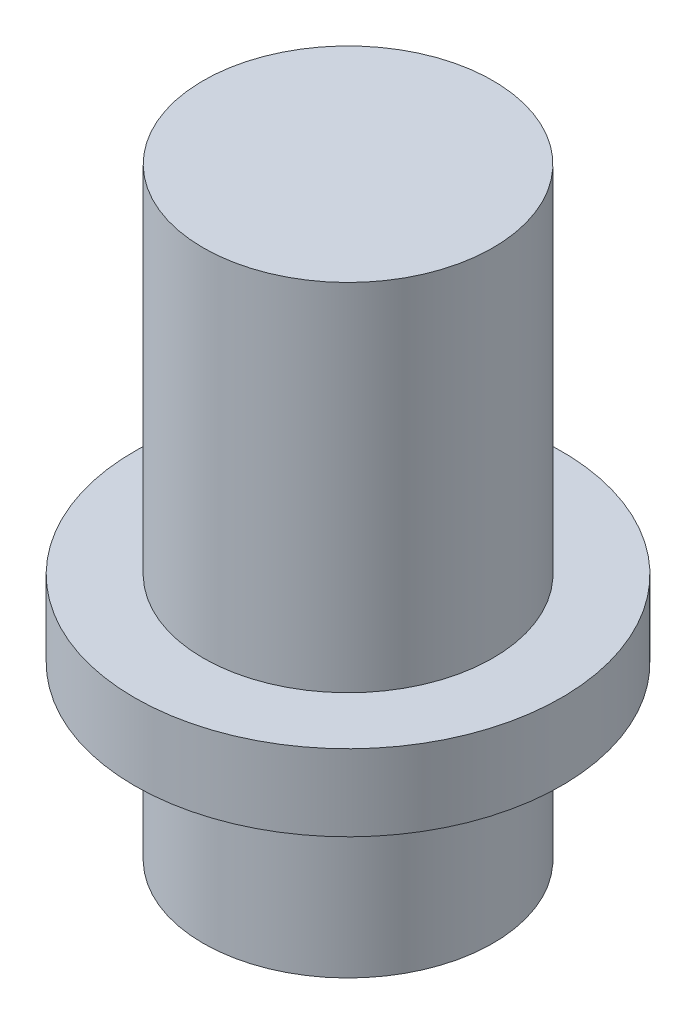
ISO-10303-21;
HEADER;
FILE_DESCRIPTION(('STEP AP214'),'2;1');
FILE_NAME('part.step','',(''),(''),'','','');
FILE_SCHEMA(('AUTOMOTIVE_DESIGN { 1 0 10303 214 1 1 1 1 }'));
ENDSEC;
DATA;
#1=APPLICATION_CONTEXT('core data for automotive mechanical design processes');
#2=APPLICATION_PROTOCOL_DEFINITION('international standard','automotive_design',2000,#1);
#3=PRODUCT_CONTEXT('',#1,'mechanical');
#4=PRODUCT('Part','Part','',(#3));
#5=PRODUCT_RELATED_PRODUCT_CATEGORY('part','',(#4));
#6=PRODUCT_DEFINITION_FORMATION('','',#4);
#7=PRODUCT_DEFINITION_CONTEXT('part definition',#1,'design');
#8=PRODUCT_DEFINITION('design','',#6,#7);
#9=PRODUCT_DEFINITION_SHAPE('','',#8);
#10=(LENGTH_UNIT() NAMED_UNIT(*) SI_UNIT(.MILLI.,.METRE.));
#11=(NAMED_UNIT(*) PLANE_ANGLE_UNIT() SI_UNIT($,.RADIAN.));
#12=(NAMED_UNIT(*) SI_UNIT($,.STERADIAN.) SOLID_ANGLE_UNIT());
#13=UNCERTAINTY_MEASURE_WITH_UNIT(LENGTH_MEASURE(1.E-05),#10,'distance_accuracy_value','');
#14=(GEOMETRIC_REPRESENTATION_CONTEXT(3) GLOBAL_UNCERTAINTY_ASSIGNED_CONTEXT((#13)) GLOBAL_UNIT_ASSIGNED_CONTEXT((#10,
#11,#12)) REPRESENTATION_CONTEXT('',''));
#15=CARTESIAN_POINT('',(0.,0.,0.));
#16=DIRECTION('',(0.,0.,1.));
#17=DIRECTION('',(1.,0.,0.));
#18=AXIS2_PLACEMENT_3D('',#15,#16,#17);
#19=CARTESIAN_POINT('',(0.,11.2,0.));
#20=DIRECTION('',(0.,-1.,0.));
#21=DIRECTION('',(0.,0.,-1.));
#22=AXIS2_PLACEMENT_3D('',#19,#20,#21);
#23=CYLINDRICAL_SURFACE('',#22,9.5);
#24=CARTESIAN_POINT('',(0.,11.2,0.));
#25=DIRECTION('',(0.,1.,0.));
#26=DIRECTION('',(0.,0.,1.));
#27=AXIS2_PLACEMENT_3D('',#24,#25,#26);
#28=CIRCLE('',#27,9.5);
#29=CARTESIAN_POINT('',(0.,11.2,9.5));
#30=VERTEX_POINT('',#29);
#31=EDGE_CURVE('E49',#30,#30,#28,.T.);
#32=ORIENTED_EDGE('',*,*,#31,.F.);
#33=EDGE_LOOP('',(#32));
#34=FACE_BOUND('',#33,.T.);
#35=CARTESIAN_POINT('',(0.,0.,0.));
#36=DIRECTION('',(0.,1.,0.));
#37=DIRECTION('',(0.,0.,1.));
#38=AXIS2_PLACEMENT_3D('',#35,#36,#37);
#39=CIRCLE('',#38,9.5);
#40=CARTESIAN_POINT('',(0.,0.,9.5));
#41=VERTEX_POINT('',#40);
#42=EDGE_CURVE('E44',#41,#41,#39,.T.);
#43=ORIENTED_EDGE('',*,*,#42,.T.);
#44=EDGE_LOOP('',(#43));
#45=FACE_BOUND('',#44,.T.);
#46=ADVANCED_FACE('F41',(#34,#45),#23,.T.);
#47=CARTESIAN_POINT('',(0.,0.,0.));
#48=DIRECTION('',(0.,1.,0.));
#49=DIRECTION('',(0.,0.,1.));
#50=AXIS2_PLACEMENT_3D('',#47,#48,#49);
#51=PLANE('',#50);
#52=ORIENTED_EDGE('',*,*,#42,.F.);
#53=EDGE_LOOP('',(#52));
#54=FACE_BOUND('',#53,.T.);
#55=ADVANCED_FACE('F87',(#54),#51,.F.);
#56=CARTESIAN_POINT('',(0.,16.2,0.));
#57=DIRECTION('',(0.,-1.,0.));
#58=DIRECTION('',(0.,0.,-1.));
#59=AXIS2_PLACEMENT_3D('',#56,#57,#58);
#60=CYLINDRICAL_SURFACE('',#59,14.);
#61=CARTESIAN_POINT('',(0.,16.2,0.));
#62=DIRECTION('',(0.,1.,0.));
#63=DIRECTION('',(0.,0.,1.));
#64=AXIS2_PLACEMENT_3D('',#61,#62,#63);
#65=CIRCLE('',#64,14.);
#66=CARTESIAN_POINT('',(0.,16.2,14.));
#67=VERTEX_POINT('',#66);
#68=EDGE_CURVE('E58',#67,#67,#65,.T.);
#69=ORIENTED_EDGE('',*,*,#68,.F.);
#70=EDGE_LOOP('',(#69));
#71=FACE_BOUND('',#70,.T.);
#72=CARTESIAN_POINT('',(0.,11.2,0.));
#73=DIRECTION('',(0.,1.,0.));
#74=DIRECTION('',(0.,0.,1.));
#75=AXIS2_PLACEMENT_3D('',#72,#73,#74);
#76=CIRCLE('',#75,14.);
#77=CARTESIAN_POINT('',(0.,11.2,14.));
#78=VERTEX_POINT('',#77);
#79=EDGE_CURVE('E62',#78,#78,#76,.T.);
#80=ORIENTED_EDGE('',*,*,#79,.T.);
#81=EDGE_LOOP('',(#80));
#82=FACE_BOUND('',#81,.T.);
#83=ADVANCED_FACE('F92',(#71,#82),#60,.T.);
#84=CARTESIAN_POINT('',(0.,16.2,0.));
#85=DIRECTION('',(0.,1.,0.));
#86=DIRECTION('',(0.,0.,1.));
#87=AXIS2_PLACEMENT_3D('',#84,#85,#86);
#88=PLANE('',#87);
#89=CARTESIAN_POINT('',(0.,16.2,0.));
#90=DIRECTION('',(0.,1.,0.));
#91=DIRECTION('',(0.,0.,1.));
#92=AXIS2_PLACEMENT_3D('',#89,#90,#91);
#93=CIRCLE('',#92,9.5);
#94=CARTESIAN_POINT('',(0.,16.2,9.5));
#95=VERTEX_POINT('',#94);
#96=EDGE_CURVE('E10',#95,#95,#93,.T.);
#97=ORIENTED_EDGE('',*,*,#96,.F.);
#98=EDGE_LOOP('',(#97));
#99=FACE_BOUND('',#98,.T.);
#100=ORIENTED_EDGE('',*,*,#68,.T.);
#101=EDGE_LOOP('',(#100));
#102=FACE_BOUND('',#101,.T.);
#103=ADVANCED_FACE('F82',(#99,#102),#88,.T.);
#104=CARTESIAN_POINT('',(0.,11.2,0.));
#105=DIRECTION('',(0.,1.,0.));
#106=DIRECTION('',(0.,0.,1.));
#107=AXIS2_PLACEMENT_3D('',#104,#105,#106);
#108=PLANE('',#107);
#109=ORIENTED_EDGE('',*,*,#31,.T.);
#110=EDGE_LOOP('',(#109));
#111=FACE_BOUND('',#110,.T.);
#112=ORIENTED_EDGE('',*,*,#79,.F.);
#113=EDGE_LOOP('',(#112));
#114=FACE_BOUND('',#113,.T.);
#115=ADVANCED_FACE('F75',(#111,#114),#108,.F.);
#116=CARTESIAN_POINT('',(0.,39.5,0.));
#117=DIRECTION('',(0.,-1.,0.));
#118=DIRECTION('',(0.,0.,-1.));
#119=AXIS2_PLACEMENT_3D('',#116,#117,#118);
#120=CYLINDRICAL_SURFACE('',#119,9.5);
#121=CARTESIAN_POINT('',(0.,39.5,0.));
#122=DIRECTION('',(0.,1.,0.));
#123=DIRECTION('',(0.,0.,1.));
#124=AXIS2_PLACEMENT_3D('',#121,#122,#123);
#125=CIRCLE('',#124,9.5);
#126=CARTESIAN_POINT('',(0.,39.5,9.5));
#127=VERTEX_POINT('',#126);
#128=EDGE_CURVE('E57',#127,#127,#125,.T.);
#129=ORIENTED_EDGE('',*,*,#128,.F.);
#130=EDGE_LOOP('',(#129));
#131=FACE_BOUND('',#130,.T.);
#132=ORIENTED_EDGE('',*,*,#96,.T.);
#133=EDGE_LOOP('',(#132));
#134=FACE_BOUND('',#133,.T.);
#135=ADVANCED_FACE('F73',(#131,#134),#120,.T.);
#136=CARTESIAN_POINT('',(0.,39.5,0.));
#137=DIRECTION('',(0.,1.,0.));
#138=DIRECTION('',(0.,0.,1.));
#139=AXIS2_PLACEMENT_3D('',#136,#137,#138);
#140=PLANE('',#139);
#141=ORIENTED_EDGE('',*,*,#128,.T.);
#142=EDGE_LOOP('',(#141));
#143=FACE_BOUND('',#142,.T.);
#144=ADVANCED_FACE('F71',(#143),#140,.T.);
#145=CLOSED_SHELL('',(#46,#55,#83,#103,#115,#135,#144));
#146=MANIFOLD_SOLID_BREP('B2',#145);
#147=ADVANCED_BREP_SHAPE_REPRESENTATION('',(#18,#146),#14);
#148=SHAPE_DEFINITION_REPRESENTATION(#9,#147);
ENDSEC;
END-ISO-10303-21;
